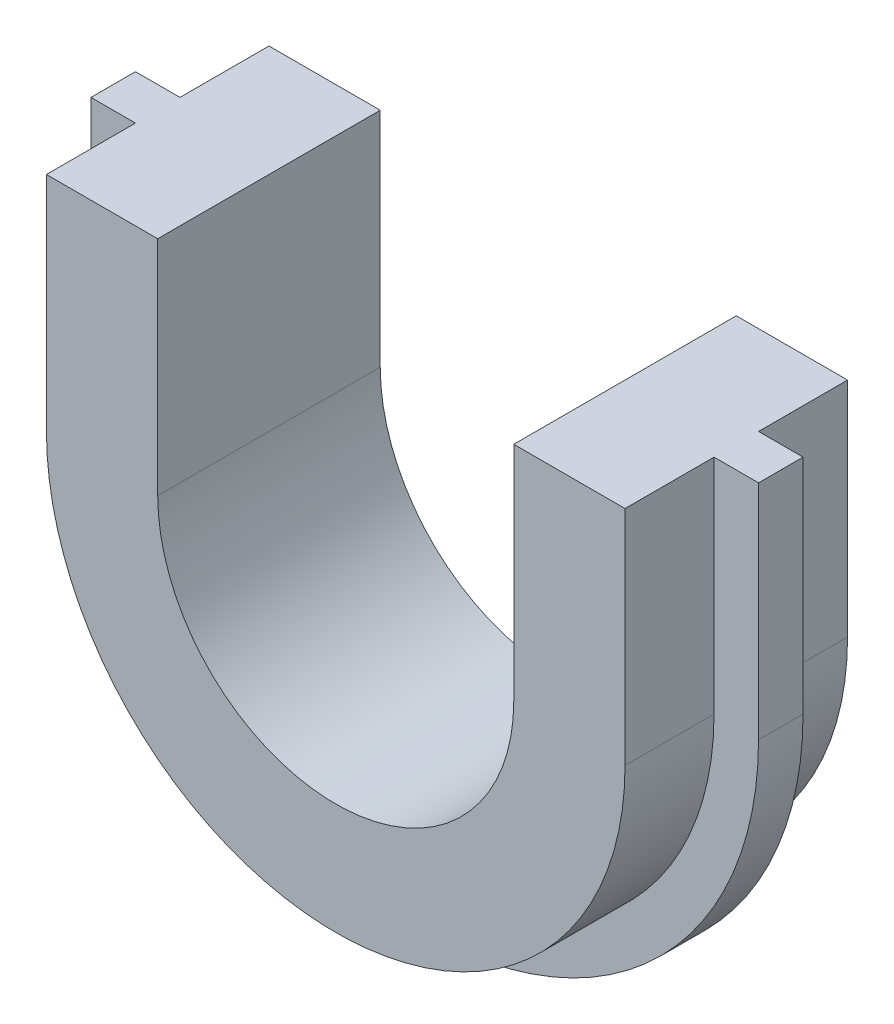
ISO-10303-21;
HEADER;
FILE_DESCRIPTION(('STEP AP214'),'2;1');
FILE_NAME('part.step','',(''),(''),'','','');
FILE_SCHEMA(('AUTOMOTIVE_DESIGN { 1 0 10303 214 1 1 1 1 }'));
ENDSEC;
DATA;
#1=APPLICATION_CONTEXT('core data for automotive mechanical design processes');
#2=APPLICATION_PROTOCOL_DEFINITION('international standard','automotive_design',2000,#1);
#3=PRODUCT_CONTEXT('',#1,'mechanical');
#4=PRODUCT('Part','Part','',(#3));
#5=PRODUCT_RELATED_PRODUCT_CATEGORY('part','',(#4));
#6=PRODUCT_DEFINITION_FORMATION('','',#4);
#7=PRODUCT_DEFINITION_CONTEXT('part definition',#1,'design');
#8=PRODUCT_DEFINITION('design','',#6,#7);
#9=PRODUCT_DEFINITION_SHAPE('','',#8);
#10=(LENGTH_UNIT() NAMED_UNIT(*) SI_UNIT(.MILLI.,.METRE.));
#11=(NAMED_UNIT(*) PLANE_ANGLE_UNIT() SI_UNIT($,.RADIAN.));
#12=(NAMED_UNIT(*) SI_UNIT($,.STERADIAN.) SOLID_ANGLE_UNIT());
#13=UNCERTAINTY_MEASURE_WITH_UNIT(LENGTH_MEASURE(1.E-05),#10,'distance_accuracy_value','');
#14=(GEOMETRIC_REPRESENTATION_CONTEXT(3) GLOBAL_UNCERTAINTY_ASSIGNED_CONTEXT((#13)) GLOBAL_UNIT_ASSIGNED_CONTEXT((#10,
#11,#12)) REPRESENTATION_CONTEXT('',''));
#15=CARTESIAN_POINT('',(0.,0.,0.));
#16=DIRECTION('',(0.,0.,1.));
#17=DIRECTION('',(1.,0.,0.));
#18=AXIS2_PLACEMENT_3D('',#15,#16,#17);
#19=CARTESIAN_POINT('',(0.,23.5,0.));
#20=DIRECTION('',(0.,0.,1.));
#21=DIRECTION('',(1.,0.,0.));
#22=AXIS2_PLACEMENT_3D('',#19,#20,#21);
#23=PLANE('',#22);
#24=CARTESIAN_POINT('',(0.,25.,0.));
#25=DIRECTION('',(0.,0.,1.));
#26=DIRECTION('',(-1.,0.,0.));
#27=AXIS2_PLACEMENT_3D('',#24,#25,#26);
#28=CIRCLE('',#27,13.);
#29=CARTESIAN_POINT('',(-13.,25.,0.));
#30=VERTEX_POINT('',#29);
#31=CARTESIAN_POINT('',(13.,25.,0.));
#32=VERTEX_POINT('',#31);
#33=EDGE_CURVE('E274',#30,#32,#28,.T.);
#34=ORIENTED_EDGE('',*,*,#33,.F.);
#35=DIRECTION('',(0.,1.,0.));
#36=VECTOR('',#35,1.);
#37=CARTESIAN_POINT('',(-13.,25.,0.));
#38=LINE('',#37,#36);
#39=CARTESIAN_POINT('',(-13.,35.,0.));
#40=VERTEX_POINT('',#39);
#41=EDGE_CURVE('E260',#30,#40,#38,.T.);
#42=ORIENTED_EDGE('',*,*,#41,.T.);
#43=DIRECTION('',(1.,0.,0.));
#44=VECTOR('',#43,1.);
#45=CARTESIAN_POINT('',(-13.,35.,0.));
#46=LINE('',#45,#44);
#47=CARTESIAN_POINT('',(-8.,35.,0.));
#48=VERTEX_POINT('',#47);
#49=EDGE_CURVE('E251',#40,#48,#46,.T.);
#50=ORIENTED_EDGE('',*,*,#49,.T.);
#51=DIRECTION('',(0.,-1.,0.));
#52=VECTOR('',#51,1.);
#53=CARTESIAN_POINT('',(-8.,35.,0.));
#54=LINE('',#53,#52);
#55=CARTESIAN_POINT('',(-8.,25.0000003725,0.));
#56=VERTEX_POINT('',#55);
#57=EDGE_CURVE('E242',#48,#56,#54,.T.);
#58=ORIENTED_EDGE('',*,*,#57,.T.);
#59=CARTESIAN_POINT('',(0.,25.,0.));
#60=DIRECTION('',(0.,0.,1.));
#61=DIRECTION('',(-1.,4.65624999668179E-08,0.));
#62=AXIS2_PLACEMENT_3D('',#59,#60,#61);
#63=CIRCLE('',#62,8.);
#64=CARTESIAN_POINT('',(8.,25.0000003526218,0.));
#65=VERTEX_POINT('',#64);
#66=EDGE_CURVE('E189',#56,#65,#63,.T.);
#67=ORIENTED_EDGE('',*,*,#66,.T.);
#68=DIRECTION('',(0.,-1.,0.));
#69=VECTOR('',#68,1.);
#70=CARTESIAN_POINT('',(8.,35.,0.));
#71=LINE('',#70,#69);
#72=CARTESIAN_POINT('',(8.,35.,0.));
#73=VERTEX_POINT('',#72);
#74=EDGE_CURVE('E181',#73,#65,#71,.T.);
#75=ORIENTED_EDGE('',*,*,#74,.F.);
#76=DIRECTION('',(-1.,0.,0.));
#77=VECTOR('',#76,1.);
#78=CARTESIAN_POINT('',(13.,35.,0.));
#79=LINE('',#78,#77);
#80=CARTESIAN_POINT('',(13.,35.,0.));
#81=VERTEX_POINT('',#80);
#82=EDGE_CURVE('E163',#81,#73,#79,.T.);
#83=ORIENTED_EDGE('',*,*,#82,.F.);
#84=DIRECTION('',(0.,-1.,0.));
#85=VECTOR('',#84,1.);
#86=CARTESIAN_POINT('',(13.,35.,0.));
#87=LINE('',#86,#85);
#88=EDGE_CURVE('E284',#81,#32,#87,.T.);
#89=ORIENTED_EDGE('',*,*,#88,.T.);
#90=EDGE_LOOP('',(#34,#42,#50,#58,#67,#75,#83,#89));
#91=FACE_BOUND('',#90,.T.);
#92=ADVANCED_FACE('F16',(#91),#23,.F.);
#93=CARTESIAN_POINT('',(0.,23.5,10.));
#94=DIRECTION('',(0.,0.,1.));
#95=DIRECTION('',(1.,0.,0.));
#96=AXIS2_PLACEMENT_3D('',#93,#94,#95);
#97=PLANE('',#96);
#98=CARTESIAN_POINT('',(0.,25.,10.));
#99=DIRECTION('',(0.,0.,1.));
#100=DIRECTION('',(-1.,0.,0.));
#101=AXIS2_PLACEMENT_3D('',#98,#99,#100);
#102=CIRCLE('',#101,13.);
#103=CARTESIAN_POINT('',(-13.,25.,10.));
#104=VERTEX_POINT('',#103);
#105=CARTESIAN_POINT('',(13.,25.,10.));
#106=VERTEX_POINT('',#105);
#107=EDGE_CURVE('E10',#104,#106,#102,.T.);
#108=ORIENTED_EDGE('',*,*,#107,.T.);
#109=DIRECTION('',(0.,1.,0.));
#110=VECTOR('',#109,1.);
#111=CARTESIAN_POINT('',(13.,35.,10.));
#112=LINE('',#111,#110);
#113=CARTESIAN_POINT('',(13.,35.,10.));
#114=VERTEX_POINT('',#113);
#115=EDGE_CURVE('E42',#106,#114,#112,.T.);
#116=ORIENTED_EDGE('',*,*,#115,.T.);
#117=DIRECTION('',(-1.,0.,0.));
#118=VECTOR('',#117,1.);
#119=CARTESIAN_POINT('',(13.,35.,10.));
#120=LINE('',#119,#118);
#121=CARTESIAN_POINT('',(8.,35.,10.));
#122=VERTEX_POINT('',#121);
#123=EDGE_CURVE('E180',#114,#122,#120,.T.);
#124=ORIENTED_EDGE('',*,*,#123,.T.);
#125=DIRECTION('',(0.,-1.,0.));
#126=VECTOR('',#125,1.);
#127=CARTESIAN_POINT('',(8.,35.,10.));
#128=LINE('',#127,#126);
#129=CARTESIAN_POINT('',(8.,25.0000003526218,10.));
#130=VERTEX_POINT('',#129);
#131=EDGE_CURVE('E182',#122,#130,#128,.T.);
#132=ORIENTED_EDGE('',*,*,#131,.T.);
#133=CARTESIAN_POINT('',(0.,25.,10.));
#134=DIRECTION('',(0.,0.,-1.));
#135=DIRECTION('',(-1.,4.65624999668179E-08,0.));
#136=AXIS2_PLACEMENT_3D('',#133,#134,#135);
#137=CIRCLE('',#136,8.);
#138=CARTESIAN_POINT('',(-8.,25.0000003725,10.));
#139=VERTEX_POINT('',#138);
#140=EDGE_CURVE('E199',#130,#139,#137,.T.);
#141=ORIENTED_EDGE('',*,*,#140,.T.);
#142=DIRECTION('',(0.,1.,0.));
#143=VECTOR('',#142,1.);
#144=CARTESIAN_POINT('',(-8.,35.,10.));
#145=LINE('',#144,#143);
#146=CARTESIAN_POINT('',(-8.,35.,10.));
#147=VERTEX_POINT('',#146);
#148=EDGE_CURVE('E239',#139,#147,#145,.T.);
#149=ORIENTED_EDGE('',*,*,#148,.T.);
#150=DIRECTION('',(-1.,0.,0.));
#151=VECTOR('',#150,1.);
#152=CARTESIAN_POINT('',(-13.,35.,10.));
#153=LINE('',#152,#151);
#154=CARTESIAN_POINT('',(-13.,35.,10.));
#155=VERTEX_POINT('',#154);
#156=EDGE_CURVE('E248',#147,#155,#153,.T.);
#157=ORIENTED_EDGE('',*,*,#156,.T.);
#158=DIRECTION('',(0.,-1.,0.));
#159=VECTOR('',#158,1.);
#160=CARTESIAN_POINT('',(-13.,25.,10.));
#161=LINE('',#160,#159);
#162=EDGE_CURVE('E268',#155,#104,#161,.T.);
#163=ORIENTED_EDGE('',*,*,#162,.T.);
#164=EDGE_LOOP('',(#108,#116,#124,#132,#141,#149,#157,#163));
#165=FACE_BOUND('',#164,.T.);
#166=ADVANCED_FACE('F221',(#165),#97,.T.);
#167=CARTESIAN_POINT('',(0.,25.,0.));
#168=DIRECTION('',(0.,0.,1.));
#169=DIRECTION('',(-1.,0.,0.));
#170=AXIS2_PLACEMENT_3D('',#167,#168,#169);
#171=CYLINDRICAL_SURFACE('',#170,13.);
#172=CARTESIAN_POINT('',(0.,25.,6.00000008940697));
#173=DIRECTION('',(0.,0.,1.));
#174=DIRECTION('',(-1.,0.,0.));
#175=AXIS2_PLACEMENT_3D('',#172,#173,#174);
#176=CIRCLE('',#175,13.);
#177=CARTESIAN_POINT('',(-13.0000001937151,25.,6.00000008940697));
#178=VERTEX_POINT('',#177);
#179=CARTESIAN_POINT('',(13.0000001937151,25.,6.00000008940697));
#180=VERTEX_POINT('',#179);
#181=EDGE_CURVE('E220',#178,#180,#176,.T.);
#182=ORIENTED_EDGE('',*,*,#181,.T.);
#183=DIRECTION('',(0.,0.,1.));
#184=VECTOR('',#183,1.);
#185=CARTESIAN_POINT('',(13.,25.,0.));
#186=LINE('',#185,#184);
#187=EDGE_CURVE('E24',#180,#106,#186,.T.);
#188=ORIENTED_EDGE('',*,*,#187,.T.);
#189=ORIENTED_EDGE('',*,*,#107,.F.);
#190=DIRECTION('',(0.,0.,1.));
#191=VECTOR('',#190,1.);
#192=CARTESIAN_POINT('',(-13.,25.,0.));
#193=LINE('',#192,#191);
#194=EDGE_CURVE('E271',#178,#104,#193,.T.);
#195=ORIENTED_EDGE('',*,*,#194,.F.);
#196=EDGE_LOOP('',(#182,#188,#189,#195));
#197=FACE_BOUND('',#196,.T.);
#198=ADVANCED_FACE('F214',(#197),#171,.T.);
#199=CARTESIAN_POINT('',(13.,25.,0.));
#200=DIRECTION('',(1.,0.,0.));
#201=DIRECTION('',(0.,1.,0.));
#202=AXIS2_PLACEMENT_3D('',#199,#200,#201);
#203=PLANE('',#202);
#204=DIRECTION('',(0.,1.,0.));
#205=VECTOR('',#204,1.);
#206=CARTESIAN_POINT('',(13.,30.,6.00000008940697));
#207=LINE('',#206,#205);
#208=CARTESIAN_POINT('',(13.0000001937151,35.,6.00000008940697));
#209=VERTEX_POINT('',#208);
#210=EDGE_CURVE('E225',#180,#209,#207,.T.);
#211=ORIENTED_EDGE('',*,*,#210,.T.);
#212=DIRECTION('',(0.,0.,1.));
#213=VECTOR('',#212,1.);
#214=CARTESIAN_POINT('',(13.,35.,0.));
#215=LINE('',#214,#213);
#216=EDGE_CURVE('E206',#209,#114,#215,.T.);
#217=ORIENTED_EDGE('',*,*,#216,.T.);
#218=ORIENTED_EDGE('',*,*,#115,.F.);
#219=ORIENTED_EDGE('',*,*,#187,.F.);
#220=EDGE_LOOP('',(#211,#217,#218,#219));
#221=FACE_BOUND('',#220,.T.);
#222=ADVANCED_FACE('F222',(#221),#203,.T.);
#223=CARTESIAN_POINT('',(13.,35.,0.));
#224=DIRECTION('',(0.,1.,0.));
#225=DIRECTION('',(1.,0.,0.));
#226=AXIS2_PLACEMENT_3D('',#223,#224,#225);
#227=PLANE('',#226);
#228=ORIENTED_EDGE('',*,*,#82,.T.);
#229=DIRECTION('',(0.,0.,1.));
#230=VECTOR('',#229,1.);
#231=CARTESIAN_POINT('',(8.,35.,0.));
#232=LINE('',#231,#230);
#233=EDGE_CURVE('E169',#73,#122,#232,.T.);
#234=ORIENTED_EDGE('',*,*,#233,.T.);
#235=ORIENTED_EDGE('',*,*,#123,.F.);
#236=ORIENTED_EDGE('',*,*,#216,.F.);
#237=DIRECTION('',(1.,0.,0.));
#238=VECTOR('',#237,1.);
#239=CARTESIAN_POINT('',(13.0000001937151,35.,6.00000008940697));
#240=LINE('',#239,#238);
#241=CARTESIAN_POINT('',(15.0000002235174,35.,6.00000008940697));
#242=VERTEX_POINT('',#241);
#243=EDGE_CURVE('E306',#209,#242,#240,.T.);
#244=ORIENTED_EDGE('',*,*,#243,.T.);
#245=DIRECTION('',(0.,0.,-1.));
#246=VECTOR('',#245,1.);
#247=CARTESIAN_POINT('',(15.0000002235174,35.,6.00000008940697));
#248=LINE('',#247,#246);
#249=CARTESIAN_POINT('',(15.0000002235174,35.,4.00000005960464));
#250=VERTEX_POINT('',#249);
#251=EDGE_CURVE('E341',#242,#250,#248,.T.);
#252=ORIENTED_EDGE('',*,*,#251,.T.);
#253=DIRECTION('',(-1.,0.,0.));
#254=VECTOR('',#253,1.);
#255=CARTESIAN_POINT('',(15.0000002235174,35.,4.00000005960464));
#256=LINE('',#255,#254);
#257=CARTESIAN_POINT('',(13.0000001937151,35.,4.00000005960464));
#258=VERTEX_POINT('',#257);
#259=EDGE_CURVE('E287',#250,#258,#256,.T.);
#260=ORIENTED_EDGE('',*,*,#259,.T.);
#261=DIRECTION('',(0.,0.,1.));
#262=VECTOR('',#261,1.);
#263=CARTESIAN_POINT('',(13.,35.,0.));
#264=LINE('',#263,#262);
#265=EDGE_CURVE('E171',#81,#258,#264,.T.);
#266=ORIENTED_EDGE('',*,*,#265,.F.);
#267=EDGE_LOOP('',(#228,#234,#235,#236,#244,#252,#260,#266));
#268=FACE_BOUND('',#267,.T.);
#269=ADVANCED_FACE('F167',(#268),#227,.T.);
#270=CARTESIAN_POINT('',(8.,35.,0.));
#271=DIRECTION('',(-1.,0.,0.));
#272=DIRECTION('',(0.,0.,1.));
#273=AXIS2_PLACEMENT_3D('',#270,#271,#272);
#274=PLANE('',#273);
#275=ORIENTED_EDGE('',*,*,#74,.T.);
#276=DIRECTION('',(0.,0.,1.));
#277=VECTOR('',#276,1.);
#278=CARTESIAN_POINT('',(8.,25.0000003526218,0.));
#279=LINE('',#278,#277);
#280=EDGE_CURVE('E195',#65,#130,#279,.T.);
#281=ORIENTED_EDGE('',*,*,#280,.T.);
#282=ORIENTED_EDGE('',*,*,#131,.F.);
#283=ORIENTED_EDGE('',*,*,#233,.F.);
#284=EDGE_LOOP('',(#275,#281,#282,#283));
#285=FACE_BOUND('',#284,.T.);
#286=ADVANCED_FACE('F179',(#285),#274,.T.);
#287=CARTESIAN_POINT('',(0.,25.,0.));
#288=DIRECTION('',(0.,0.,1.));
#289=DIRECTION('',(-1.24238769844487E-09,-1.,0.));
#290=AXIS2_PLACEMENT_3D('',#287,#288,#289);
#291=CYLINDRICAL_SURFACE('',#290,8.);
#292=ORIENTED_EDGE('',*,*,#66,.F.);
#293=DIRECTION('',(0.,0.,1.));
#294=VECTOR('',#293,1.);
#295=CARTESIAN_POINT('',(-8.,25.0000003725,0.));
#296=LINE('',#295,#294);
#297=EDGE_CURVE('E230',#56,#139,#296,.T.);
#298=ORIENTED_EDGE('',*,*,#297,.T.);
#299=ORIENTED_EDGE('',*,*,#140,.F.);
#300=ORIENTED_EDGE('',*,*,#280,.F.);
#301=EDGE_LOOP('',(#292,#298,#299,#300));
#302=FACE_BOUND('',#301,.T.);
#303=ADVANCED_FACE('F229',(#302),#291,.F.);
#304=CARTESIAN_POINT('',(-8.,25.0000003725,0.));
#305=DIRECTION('',(1.,0.,0.));
#306=DIRECTION('',(0.,1.,0.));
#307=AXIS2_PLACEMENT_3D('',#304,#305,#306);
#308=PLANE('',#307);
#309=ORIENTED_EDGE('',*,*,#57,.F.);
#310=DIRECTION('',(0.,0.,1.));
#311=VECTOR('',#310,1.);
#312=CARTESIAN_POINT('',(-8.,35.,0.));
#313=LINE('',#312,#311);
#314=EDGE_CURVE('E247',#48,#147,#313,.T.);
#315=ORIENTED_EDGE('',*,*,#314,.T.);
#316=ORIENTED_EDGE('',*,*,#148,.F.);
#317=ORIENTED_EDGE('',*,*,#297,.F.);
#318=EDGE_LOOP('',(#309,#315,#316,#317));
#319=FACE_BOUND('',#318,.T.);
#320=ADVANCED_FACE('F393',(#319),#308,.T.);
#321=CARTESIAN_POINT('',(-8.,35.,0.));
#322=DIRECTION('',(0.,1.,0.));
#323=DIRECTION('',(1.,0.,0.));
#324=AXIS2_PLACEMENT_3D('',#321,#322,#323);
#325=PLANE('',#324);
#326=ORIENTED_EDGE('',*,*,#49,.F.);
#327=DIRECTION('',(0.,0.,1.));
#328=VECTOR('',#327,1.);
#329=CARTESIAN_POINT('',(-13.,35.,0.));
#330=LINE('',#329,#328);
#331=CARTESIAN_POINT('',(-13.0000001937151,35.,4.00000005960464));
#332=VERTEX_POINT('',#331);
#333=EDGE_CURVE('E261',#40,#332,#330,.T.);
#334=ORIENTED_EDGE('',*,*,#333,.T.);
#335=DIRECTION('',(1.,0.,0.));
#336=VECTOR('',#335,1.);
#337=CARTESIAN_POINT('',(-15.0000002235174,35.,4.00000005960464));
#338=LINE('',#337,#336);
#339=CARTESIAN_POINT('',(-15.0000002235174,35.,4.00000005960464));
#340=VERTEX_POINT('',#339);
#341=EDGE_CURVE('E301',#340,#332,#338,.T.);
#342=ORIENTED_EDGE('',*,*,#341,.F.);
#343=DIRECTION('',(0.,0.,-1.));
#344=VECTOR('',#343,1.);
#345=CARTESIAN_POINT('',(-15.0000002235174,35.,6.00000008940697));
#346=LINE('',#345,#344);
#347=CARTESIAN_POINT('',(-15.0000002235174,35.,6.00000008940697));
#348=VERTEX_POINT('',#347);
#349=EDGE_CURVE('E318',#348,#340,#346,.T.);
#350=ORIENTED_EDGE('',*,*,#349,.F.);
#351=DIRECTION('',(-1.,0.,0.));
#352=VECTOR('',#351,1.);
#353=CARTESIAN_POINT('',(-13.0000001937151,35.,6.00000008940697));
#354=LINE('',#353,#352);
#355=CARTESIAN_POINT('',(-13.0000001937151,35.,6.00000008940697));
#356=VERTEX_POINT('',#355);
#357=EDGE_CURVE('E313',#356,#348,#354,.T.);
#358=ORIENTED_EDGE('',*,*,#357,.F.);
#359=DIRECTION('',(0.,0.,1.));
#360=VECTOR('',#359,1.);
#361=CARTESIAN_POINT('',(-13.,35.,0.));
#362=LINE('',#361,#360);
#363=EDGE_CURVE('E262',#356,#155,#362,.T.);
#364=ORIENTED_EDGE('',*,*,#363,.T.);
#365=ORIENTED_EDGE('',*,*,#156,.F.);
#366=ORIENTED_EDGE('',*,*,#314,.F.);
#367=EDGE_LOOP('',(#326,#334,#342,#350,#358,#364,#365,#366));
#368=FACE_BOUND('',#367,.T.);
#369=ADVANCED_FACE('F386',(#368),#325,.T.);
#370=CARTESIAN_POINT('',(-13.,35.,0.));
#371=DIRECTION('',(-1.,0.,0.));
#372=DIRECTION('',(0.,0.,1.));
#373=AXIS2_PLACEMENT_3D('',#370,#371,#372);
#374=PLANE('',#373);
#375=DIRECTION('',(0.,1.,0.));
#376=VECTOR('',#375,1.);
#377=CARTESIAN_POINT('',(-13.,35.,4.00000005960464));
#378=LINE('',#377,#376);
#379=CARTESIAN_POINT('',(-13.0000001937151,25.,4.00000005960464));
#380=VERTEX_POINT('',#379);
#381=EDGE_CURVE('E299',#380,#332,#378,.T.);
#382=ORIENTED_EDGE('',*,*,#381,.T.);
#383=ORIENTED_EDGE('',*,*,#333,.F.);
#384=ORIENTED_EDGE('',*,*,#41,.F.);
#385=DIRECTION('',(0.,0.,1.));
#386=VECTOR('',#385,1.);
#387=CARTESIAN_POINT('',(-13.,25.,0.));
#388=LINE('',#387,#386);
#389=EDGE_CURVE('E279',#30,#380,#388,.T.);
#390=ORIENTED_EDGE('',*,*,#389,.T.);
#391=EDGE_LOOP('',(#382,#383,#384,#390));
#392=FACE_BOUND('',#391,.T.);
#393=ADVANCED_FACE('F390',(#392),#374,.T.);
#394=CARTESIAN_POINT('',(-13.,35.,0.));
#395=DIRECTION('',(-1.,0.,0.));
#396=DIRECTION('',(0.,0.,1.));
#397=AXIS2_PLACEMENT_3D('',#394,#395,#396);
#398=PLANE('',#397);
#399=DIRECTION('',(0.,-1.,0.));
#400=VECTOR('',#399,1.);
#401=CARTESIAN_POINT('',(-13.,35.,6.00000008940697));
#402=LINE('',#401,#400);
#403=EDGE_CURVE('E307',#356,#178,#402,.T.);
#404=ORIENTED_EDGE('',*,*,#403,.T.);
#405=ORIENTED_EDGE('',*,*,#194,.T.);
#406=ORIENTED_EDGE('',*,*,#162,.F.);
#407=ORIENTED_EDGE('',*,*,#363,.F.);
#408=EDGE_LOOP('',(#404,#405,#406,#407));
#409=FACE_BOUND('',#408,.T.);
#410=ADVANCED_FACE('F363',(#409),#398,.T.);
#411=CARTESIAN_POINT('',(0.,25.,0.));
#412=DIRECTION('',(0.,0.,1.));
#413=DIRECTION('',(-1.,0.,0.));
#414=AXIS2_PLACEMENT_3D('',#411,#412,#413);
#415=CYLINDRICAL_SURFACE('',#414,13.);
#416=CARTESIAN_POINT('',(0.,25.,4.00000005960464));
#417=DIRECTION('',(0.,0.,-1.));
#418=DIRECTION('',(-1.,0.,0.));
#419=AXIS2_PLACEMENT_3D('',#416,#417,#418);
#420=CIRCLE('',#419,13.);
#421=CARTESIAN_POINT('',(13.0000001937151,25.,4.00000005960464));
#422=VERTEX_POINT('',#421);
#423=EDGE_CURVE('E296',#422,#380,#420,.T.);
#424=ORIENTED_EDGE('',*,*,#423,.T.);
#425=ORIENTED_EDGE('',*,*,#389,.F.);
#426=ORIENTED_EDGE('',*,*,#33,.T.);
#427=DIRECTION('',(0.,0.,1.));
#428=VECTOR('',#427,1.);
#429=CARTESIAN_POINT('',(13.,25.,0.));
#430=LINE('',#429,#428);
#431=EDGE_CURVE('E286',#32,#422,#430,.T.);
#432=ORIENTED_EDGE('',*,*,#431,.T.);
#433=EDGE_LOOP('',(#424,#425,#426,#432));
#434=FACE_BOUND('',#433,.T.);
#435=ADVANCED_FACE('F384',(#434),#415,.T.);
#436=CARTESIAN_POINT('',(13.,25.,0.));
#437=DIRECTION('',(1.,0.,0.));
#438=DIRECTION('',(0.,1.,0.));
#439=AXIS2_PLACEMENT_3D('',#436,#437,#438);
#440=PLANE('',#439);
#441=DIRECTION('',(0.,-1.,0.));
#442=VECTOR('',#441,1.);
#443=CARTESIAN_POINT('',(13.,30.,4.00000005960464));
#444=LINE('',#443,#442);
#445=EDGE_CURVE('E291',#258,#422,#444,.T.);
#446=ORIENTED_EDGE('',*,*,#445,.T.);
#447=ORIENTED_EDGE('',*,*,#431,.F.);
#448=ORIENTED_EDGE('',*,*,#88,.F.);
#449=ORIENTED_EDGE('',*,*,#265,.T.);
#450=EDGE_LOOP('',(#446,#447,#448,#449));
#451=FACE_BOUND('',#450,.T.);
#452=ADVANCED_FACE('F381',(#451),#440,.T.);
#453=CARTESIAN_POINT('',(-15.0000002235174,35.,4.00000005960464));
#454=DIRECTION('',(0.,0.,-1.));
#455=DIRECTION('',(0.,-1.,0.));
#456=AXIS2_PLACEMENT_3D('',#453,#454,#455);
#457=PLANE('',#456);
#458=ORIENTED_EDGE('',*,*,#341,.T.);
#459=ORIENTED_EDGE('',*,*,#381,.F.);
#460=ORIENTED_EDGE('',*,*,#423,.F.);
#461=ORIENTED_EDGE('',*,*,#445,.F.);
#462=ORIENTED_EDGE('',*,*,#259,.F.);
#463=DIRECTION('',(0.,1.,0.));
#464=VECTOR('',#463,1.);
#465=CARTESIAN_POINT('',(15.0000002235174,25.,4.00000005960464));
#466=LINE('',#465,#464);
#467=CARTESIAN_POINT('',(15.0000002235174,25.,4.00000005960464));
#468=VERTEX_POINT('',#467);
#469=EDGE_CURVE('E346',#468,#250,#466,.T.);
#470=ORIENTED_EDGE('',*,*,#469,.F.);
#471=CARTESIAN_POINT('',(0.,25.,4.00000005960464));
#472=DIRECTION('',(0.,0.,1.));
#473=DIRECTION('',(-1.,0.,0.));
#474=AXIS2_PLACEMENT_3D('',#471,#472,#473);
#475=CIRCLE('',#474,15.0000002235174);
#476=CARTESIAN_POINT('',(-15.0000002235174,25.,4.00000005960464));
#477=VERTEX_POINT('',#476);
#478=EDGE_CURVE('E330',#477,#468,#475,.T.);
#479=ORIENTED_EDGE('',*,*,#478,.F.);
#480=DIRECTION('',(0.,-1.,0.));
#481=VECTOR('',#480,1.);
#482=CARTESIAN_POINT('',(-15.0000002235174,35.,4.00000005960464));
#483=LINE('',#482,#481);
#484=EDGE_CURVE('E312',#340,#477,#483,.T.);
#485=ORIENTED_EDGE('',*,*,#484,.F.);
#486=EDGE_LOOP('',(#458,#459,#460,#461,#462,#470,#479,#485));
#487=FACE_BOUND('',#486,.T.);
#488=ADVANCED_FACE('F374',(#487),#457,.T.);
#489=CARTESIAN_POINT('',(-13.0000001937151,35.,6.00000008940697));
#490=DIRECTION('',(0.,0.,1.));
#491=DIRECTION('',(1.,0.,0.));
#492=AXIS2_PLACEMENT_3D('',#489,#490,#491);
#493=PLANE('',#492);
#494=ORIENTED_EDGE('',*,*,#357,.T.);
#495=DIRECTION('',(0.,-1.,0.));
#496=VECTOR('',#495,1.);
#497=CARTESIAN_POINT('',(-15.0000002235174,35.,6.00000008940697));
#498=LINE('',#497,#496);
#499=CARTESIAN_POINT('',(-15.0000002235174,25.,6.00000008940697));
#500=VERTEX_POINT('',#499);
#501=EDGE_CURVE('E314',#348,#500,#498,.T.);
#502=ORIENTED_EDGE('',*,*,#501,.T.);
#503=CARTESIAN_POINT('',(0.,25.,6.00000008940697));
#504=DIRECTION('',(0.,0.,1.));
#505=DIRECTION('',(-1.,0.,0.));
#506=AXIS2_PLACEMENT_3D('',#503,#504,#505);
#507=CIRCLE('',#506,15.0000002235174);
#508=CARTESIAN_POINT('',(15.0000002235174,25.,6.00000008940697));
#509=VERTEX_POINT('',#508);
#510=EDGE_CURVE('E322',#500,#509,#507,.T.);
#511=ORIENTED_EDGE('',*,*,#510,.T.);
#512=DIRECTION('',(0.,1.,0.));
#513=VECTOR('',#512,1.);
#514=CARTESIAN_POINT('',(15.0000002235174,25.,6.00000008940697));
#515=LINE('',#514,#513);
#516=EDGE_CURVE('E331',#509,#242,#515,.T.);
#517=ORIENTED_EDGE('',*,*,#516,.T.);
#518=ORIENTED_EDGE('',*,*,#243,.F.);
#519=ORIENTED_EDGE('',*,*,#210,.F.);
#520=ORIENTED_EDGE('',*,*,#181,.F.);
#521=ORIENTED_EDGE('',*,*,#403,.F.);
#522=EDGE_LOOP('',(#494,#502,#511,#517,#518,#519,#520,#521));
#523=FACE_BOUND('',#522,.T.);
#524=ADVANCED_FACE('F364',(#523),#493,.T.);
#525=CARTESIAN_POINT('',(-15.0000002235174,35.,6.00000008940697));
#526=DIRECTION('',(-1.,0.,0.));
#527=DIRECTION('',(0.,0.,1.));
#528=AXIS2_PLACEMENT_3D('',#525,#526,#527);
#529=PLANE('',#528);
#530=ORIENTED_EDGE('',*,*,#349,.T.);
#531=ORIENTED_EDGE('',*,*,#484,.T.);
#532=DIRECTION('',(0.,0.,-1.));
#533=VECTOR('',#532,1.);
#534=CARTESIAN_POINT('',(-15.0000002235174,25.,6.00000008940697));
#535=LINE('',#534,#533);
#536=EDGE_CURVE('E329',#500,#477,#535,.T.);
#537=ORIENTED_EDGE('',*,*,#536,.F.);
#538=ORIENTED_EDGE('',*,*,#501,.F.);
#539=EDGE_LOOP('',(#530,#531,#537,#538));
#540=FACE_BOUND('',#539,.T.);
#541=ADVANCED_FACE('F397',(#540),#529,.T.);
#542=CARTESIAN_POINT('',(0.,25.,5.00000007450581));
#543=DIRECTION('',(0.,0.,1.));
#544=DIRECTION('',(-1.,0.,0.));
#545=AXIS2_PLACEMENT_3D('',#542,#543,#544);
#546=CYLINDRICAL_SURFACE('',#545,15.0000002235174);
#547=ORIENTED_EDGE('',*,*,#536,.T.);
#548=ORIENTED_EDGE('',*,*,#478,.T.);
#549=DIRECTION('',(0.,0.,-1.));
#550=VECTOR('',#549,1.);
#551=CARTESIAN_POINT('',(15.0000002235174,25.,6.00000008940697));
#552=LINE('',#551,#550);
#553=EDGE_CURVE('E351',#509,#468,#552,.T.);
#554=ORIENTED_EDGE('',*,*,#553,.F.);
#555=ORIENTED_EDGE('',*,*,#510,.F.);
#556=EDGE_LOOP('',(#547,#548,#554,#555));
#557=FACE_BOUND('',#556,.T.);
#558=ADVANCED_FACE('F405',(#557),#546,.T.);
#559=CARTESIAN_POINT('',(15.0000002235174,25.,6.00000008940697));
#560=DIRECTION('',(1.,0.,0.));
#561=DIRECTION('',(0.,1.,0.));
#562=AXIS2_PLACEMENT_3D('',#559,#560,#561);
#563=PLANE('',#562);
#564=ORIENTED_EDGE('',*,*,#553,.T.);
#565=ORIENTED_EDGE('',*,*,#469,.T.);
#566=ORIENTED_EDGE('',*,*,#251,.F.);
#567=ORIENTED_EDGE('',*,*,#516,.F.);
#568=EDGE_LOOP('',(#564,#565,#566,#567));
#569=FACE_BOUND('',#568,.T.);
#570=ADVANCED_FACE('F371',(#569),#563,.T.);
#571=CLOSED_SHELL('',(#92,#166,#198,#222,#269,#286,#303,#320,#369,#393,#410,#435,#452,#488,#524,
#541,#558,#570));
#572=MANIFOLD_SOLID_BREP('B1',#571);
#573=ADVANCED_BREP_SHAPE_REPRESENTATION('',(#18,#572),#14);
#574=SHAPE_DEFINITION_REPRESENTATION(#9,#573);
ENDSEC;
END-ISO-10303-21;
